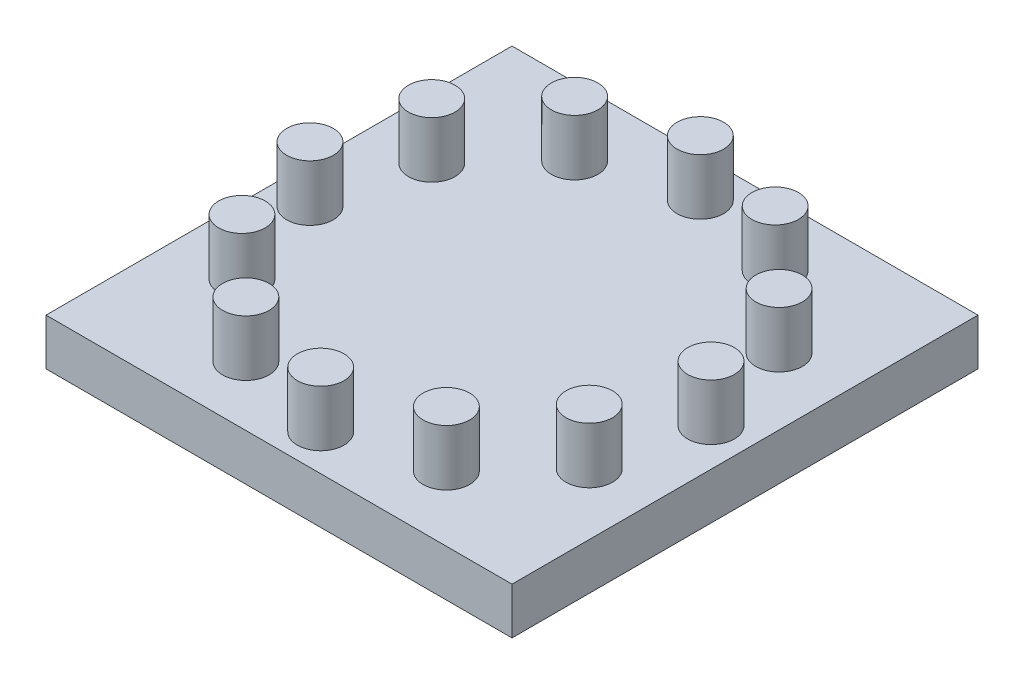
ISO-10303-21;
HEADER;
FILE_DESCRIPTION(('STEP AP214'),'2;1');
FILE_NAME('part.step','',(''),(''),'','','');
FILE_SCHEMA(('AUTOMOTIVE_DESIGN { 1 0 10303 214 1 1 1 1 }'));
ENDSEC;
DATA;
#1=APPLICATION_CONTEXT('core data for automotive mechanical design processes');
#2=APPLICATION_PROTOCOL_DEFINITION('international standard','automotive_design',2000,#1);
#3=PRODUCT_CONTEXT('',#1,'mechanical');
#4=PRODUCT('Part','Part','',(#3));
#5=PRODUCT_RELATED_PRODUCT_CATEGORY('part','',(#4));
#6=PRODUCT_DEFINITION_FORMATION('','',#4);
#7=PRODUCT_DEFINITION_CONTEXT('part definition',#1,'design');
#8=PRODUCT_DEFINITION('design','',#6,#7);
#9=PRODUCT_DEFINITION_SHAPE('','',#8);
#10=(LENGTH_UNIT() NAMED_UNIT(*) SI_UNIT(.MILLI.,.METRE.));
#11=(NAMED_UNIT(*) PLANE_ANGLE_UNIT() SI_UNIT($,.RADIAN.));
#12=(NAMED_UNIT(*) SI_UNIT($,.STERADIAN.) SOLID_ANGLE_UNIT());
#13=UNCERTAINTY_MEASURE_WITH_UNIT(LENGTH_MEASURE(1.E-05),#10,'distance_accuracy_value','');
#14=(GEOMETRIC_REPRESENTATION_CONTEXT(3) GLOBAL_UNCERTAINTY_ASSIGNED_CONTEXT((#13)) GLOBAL_UNIT_ASSIGNED_CONTEXT((#10,
#11,#12)) REPRESENTATION_CONTEXT('',''));
#15=CARTESIAN_POINT('',(0.,0.,0.));
#16=DIRECTION('',(0.,0.,1.));
#17=DIRECTION('',(1.,0.,0.));
#18=AXIS2_PLACEMENT_3D('',#15,#16,#17);
#19=CARTESIAN_POINT('',(50.,10.,-50.));
#20=DIRECTION('',(-1.,0.,0.));
#21=DIRECTION('',(0.,0.,1.));
#22=AXIS2_PLACEMENT_3D('',#19,#20,#21);
#23=PLANE('',#22);
#24=DIRECTION('',(0.,0.,-1.));
#25=VECTOR('',#24,1.);
#26=CARTESIAN_POINT('',(50.,0.,-50.));
#27=LINE('',#26,#25);
#28=CARTESIAN_POINT('',(50.,0.,50.));
#29=VERTEX_POINT('',#28);
#30=CARTESIAN_POINT('',(50.,0.,-50.));
#31=VERTEX_POINT('',#30);
#32=EDGE_CURVE('E102',#29,#31,#27,.T.);
#33=ORIENTED_EDGE('',*,*,#32,.T.);
#34=DIRECTION('',(0.,-1.,0.));
#35=VECTOR('',#34,1.);
#36=CARTESIAN_POINT('',(50.,10.,-50.));
#37=LINE('',#36,#35);
#38=CARTESIAN_POINT('',(50.,10.,-50.));
#39=VERTEX_POINT('',#38);
#40=EDGE_CURVE('E11',#39,#31,#37,.T.);
#41=ORIENTED_EDGE('',*,*,#40,.F.);
#42=DIRECTION('',(0.,0.,-1.));
#43=VECTOR('',#42,1.);
#44=CARTESIAN_POINT('',(50.,10.,-50.));
#45=LINE('',#44,#43);
#46=CARTESIAN_POINT('',(50.,10.,50.));
#47=VERTEX_POINT('',#46);
#48=EDGE_CURVE('E90',#47,#39,#45,.T.);
#49=ORIENTED_EDGE('',*,*,#48,.F.);
#50=DIRECTION('',(0.,-1.,0.));
#51=VECTOR('',#50,1.);
#52=CARTESIAN_POINT('',(50.,10.,50.));
#53=LINE('',#52,#51);
#54=EDGE_CURVE('E98',#47,#29,#53,.T.);
#55=ORIENTED_EDGE('',*,*,#54,.T.);
#56=EDGE_LOOP('',(#33,#41,#49,#55));
#57=FACE_BOUND('',#56,.T.);
#58=ADVANCED_FACE('F39',(#57),#23,.F.);
#59=CARTESIAN_POINT('',(-50.,10.,-50.));
#60=DIRECTION('',(0.,0.,1.));
#61=DIRECTION('',(1.,0.,0.));
#62=AXIS2_PLACEMENT_3D('',#59,#60,#61);
#63=PLANE('',#62);
#64=DIRECTION('',(-1.,0.,0.));
#65=VECTOR('',#64,1.);
#66=CARTESIAN_POINT('',(-50.,0.,-50.));
#67=LINE('',#66,#65);
#68=CARTESIAN_POINT('',(-50.,0.,-50.));
#69=VERTEX_POINT('',#68);
#70=EDGE_CURVE('E94',#31,#69,#67,.T.);
#71=ORIENTED_EDGE('',*,*,#70,.T.);
#72=DIRECTION('',(0.,-1.,0.));
#73=VECTOR('',#72,1.);
#74=CARTESIAN_POINT('',(-50.,10.,-50.));
#75=LINE('',#74,#73);
#76=CARTESIAN_POINT('',(-50.,10.,-50.));
#77=VERTEX_POINT('',#76);
#78=EDGE_CURVE('E47',#77,#69,#75,.T.);
#79=ORIENTED_EDGE('',*,*,#78,.F.);
#80=DIRECTION('',(-1.,0.,0.));
#81=VECTOR('',#80,1.);
#82=CARTESIAN_POINT('',(-50.,10.,-50.));
#83=LINE('',#82,#81);
#84=EDGE_CURVE('E85',#39,#77,#83,.T.);
#85=ORIENTED_EDGE('',*,*,#84,.F.);
#86=ORIENTED_EDGE('',*,*,#40,.T.);
#87=EDGE_LOOP('',(#71,#79,#85,#86));
#88=FACE_BOUND('',#87,.T.);
#89=ADVANCED_FACE('F93',(#88),#63,.F.);
#90=CARTESIAN_POINT('',(-50.,10.,-50.));
#91=DIRECTION('',(1.,0.,0.));
#92=DIRECTION('',(0.,0.,-1.));
#93=AXIS2_PLACEMENT_3D('',#90,#91,#92);
#94=PLANE('',#93);
#95=DIRECTION('',(0.,0.,1.));
#96=VECTOR('',#95,1.);
#97=CARTESIAN_POINT('',(-50.,0.,-50.));
#98=LINE('',#97,#96);
#99=CARTESIAN_POINT('',(-50.,0.,50.));
#100=VERTEX_POINT('',#99);
#101=EDGE_CURVE('E72',#69,#100,#98,.T.);
#102=ORIENTED_EDGE('',*,*,#101,.T.);
#103=DIRECTION('',(0.,-1.,0.));
#104=VECTOR('',#103,1.);
#105=CARTESIAN_POINT('',(-50.,10.,50.));
#106=LINE('',#105,#104);
#107=CARTESIAN_POINT('',(-50.,10.,50.));
#108=VERTEX_POINT('',#107);
#109=EDGE_CURVE('E95',#108,#100,#106,.T.);
#110=ORIENTED_EDGE('',*,*,#109,.F.);
#111=DIRECTION('',(0.,0.,1.));
#112=VECTOR('',#111,1.);
#113=CARTESIAN_POINT('',(-50.,10.,-50.));
#114=LINE('',#113,#112);
#115=EDGE_CURVE('E88',#77,#108,#114,.T.);
#116=ORIENTED_EDGE('',*,*,#115,.F.);
#117=ORIENTED_EDGE('',*,*,#78,.T.);
#118=EDGE_LOOP('',(#102,#110,#116,#117));
#119=FACE_BOUND('',#118,.T.);
#120=ADVANCED_FACE('F96',(#119),#94,.F.);
#121=CARTESIAN_POINT('',(-50.,10.,50.));
#122=DIRECTION('',(0.,0.,-1.));
#123=DIRECTION('',(-1.,0.,0.));
#124=AXIS2_PLACEMENT_3D('',#121,#122,#123);
#125=PLANE('',#124);
#126=DIRECTION('',(1.,0.,0.));
#127=VECTOR('',#126,1.);
#128=CARTESIAN_POINT('',(-50.,0.,50.));
#129=LINE('',#128,#127);
#130=EDGE_CURVE('E78',#100,#29,#129,.T.);
#131=ORIENTED_EDGE('',*,*,#130,.T.);
#132=ORIENTED_EDGE('',*,*,#54,.F.);
#133=DIRECTION('',(1.,0.,0.));
#134=VECTOR('',#133,1.);
#135=CARTESIAN_POINT('',(-50.,10.,50.));
#136=LINE('',#135,#134);
#137=EDGE_CURVE('E55',#108,#47,#136,.T.);
#138=ORIENTED_EDGE('',*,*,#137,.F.);
#139=ORIENTED_EDGE('',*,*,#109,.T.);
#140=EDGE_LOOP('',(#131,#132,#138,#139));
#141=FACE_BOUND('',#140,.T.);
#142=ADVANCED_FACE('F110',(#141),#125,.F.);
#143=CARTESIAN_POINT('',(0.,10.,0.));
#144=DIRECTION('',(0.,1.,0.));
#145=DIRECTION('',(0.,0.,1.));
#146=AXIS2_PLACEMENT_3D('',#143,#144,#145);
#147=PLANE('',#146);
#148=CARTESIAN_POINT('',(19.9548322317061,10.,-36.5170698753172));
#149=DIRECTION('',(0.,1.,0.));
#150=DIRECTION('',(-0.499999999999989,0.,0.866025403784445));
#151=AXIS2_PLACEMENT_3D('',#148,#149,#150);
#152=CIRCLE('',#151,5.);
#153=CARTESIAN_POINT('',(17.4548322317061,10.,-32.186942856395));
#154=VERTEX_POINT('',#153);
#155=EDGE_CURVE('E182',#154,#154,#152,.T.);
#156=ORIENTED_EDGE('',*,*,#155,.F.);
#157=EDGE_LOOP('',(#156));
#158=FACE_BOUND('',#157,.T.);
#159=CARTESIAN_POINT('',(35.7056081919247,10.,-21.607737705962));
#160=DIRECTION('',(0.,1.,0.));
#161=DIRECTION('',(-0.866025403784433,0.,0.50000000000001));
#162=AXIS2_PLACEMENT_3D('',#159,#160,#161);
#163=CIRCLE('',#162,5.);
#164=CARTESIAN_POINT('',(31.3754811730026,10.,-19.1077377059619));
#165=VERTEX_POINT('',#164);
#166=EDGE_CURVE('E176',#165,#165,#163,.T.);
#167=ORIENTED_EDGE('',*,*,#166,.F.);
#168=EDGE_LOOP('',(#167));
#169=FACE_BOUND('',#168,.T.);
#170=CARTESIAN_POINT('',(41.8915142181137,10.,-0.820489313730515));
#171=DIRECTION('',(0.,1.,0.));
#172=DIRECTION('',(-1.,0.,0.));
#173=AXIS2_PLACEMENT_3D('',#170,#171,#172);
#174=CIRCLE('',#173,5.);
#175=CARTESIAN_POINT('',(36.8915142181137,10.,-0.820489313730463));
#176=VERTEX_POINT('',#175);
#177=EDGE_CURVE('E170',#176,#176,#174,.T.);
#178=ORIENTED_EDGE('',*,*,#177,.F.);
#179=EDGE_LOOP('',(#178));
#180=FACE_BOUND('',#179,.T.);
#181=CARTESIAN_POINT('',(36.8550417861008,10.,20.2747488818137));
#182=DIRECTION('',(0.,1.,0.));
#183=DIRECTION('',(-0.866025403784443,0.,-0.499999999999992));
#184=AXIS2_PLACEMENT_3D('',#181,#182,#183);
#185=CIRCLE('',#184,5.);
#186=CARTESIAN_POINT('',(32.5249147671786,10.,17.7747488818137));
#187=VERTEX_POINT('',#186);
#188=EDGE_CURVE('E164',#187,#187,#185,.T.);
#189=ORIENTED_EDGE('',*,*,#188,.F.);
#190=EDGE_LOOP('',(#189));
#191=FACE_BOUND('',#190,.T.);
#192=CARTESIAN_POINT('',(21.9457096167456,10.,36.0255248420322));
#193=DIRECTION('',(0.,1.,0.));
#194=DIRECTION('',(-0.500000000000007,0.,-0.866025403784435));
#195=AXIS2_PLACEMENT_3D('',#192,#193,#194);
#196=CIRCLE('',#195,5.);
#197=CARTESIAN_POINT('',(19.4457096167455,10.,31.6953978231101));
#198=VERTEX_POINT('',#197);
#199=EDGE_CURVE('E158',#198,#198,#196,.T.);
#200=ORIENTED_EDGE('',*,*,#199,.F.);
#201=EDGE_LOOP('',(#200));
#202=FACE_BOUND('',#201,.T.);
#203=CARTESIAN_POINT('',(1.15846122451378,10.,42.2114308682211));
#204=DIRECTION('',(0.,1.,0.));
#205=DIRECTION('',(0.,0.,-1.));
#206=AXIS2_PLACEMENT_3D('',#203,#204,#205);
#207=CIRCLE('',#206,5.);
#208=CARTESIAN_POINT('',(1.15846122451378,10.,37.2114308682211));
#209=VERTEX_POINT('',#208);
#210=EDGE_CURVE('E152',#209,#209,#207,.T.);
#211=ORIENTED_EDGE('',*,*,#210,.F.);
#212=EDGE_LOOP('',(#211));
#213=FACE_BOUND('',#212,.T.);
#214=CARTESIAN_POINT('',(-19.9367769710301,10.,37.1749584362082));
#215=DIRECTION('',(0.,1.,0.));
#216=DIRECTION('',(0.499999999999995,0.,-0.866025403784442));
#217=AXIS2_PLACEMENT_3D('',#214,#215,#216);
#218=CIRCLE('',#217,5.);
#219=CARTESIAN_POINT('',(-17.4367769710301,10.,32.844831417286));
#220=VERTEX_POINT('',#219);
#221=EDGE_CURVE('E146',#220,#220,#218,.T.);
#222=ORIENTED_EDGE('',*,*,#221,.F.);
#223=EDGE_LOOP('',(#222));
#224=FACE_BOUND('',#223,.T.);
#225=CARTESIAN_POINT('',(-35.6875529312486,10.,22.2656262668529));
#226=DIRECTION('',(0.,1.,0.));
#227=DIRECTION('',(0.866025403784436,0.,-0.500000000000004));
#228=AXIS2_PLACEMENT_3D('',#225,#226,#227);
#229=CIRCLE('',#228,5.);
#230=CARTESIAN_POINT('',(-31.3574259123264,10.,19.7656262668529));
#231=VERTEX_POINT('',#230);
#232=EDGE_CURVE('E140',#231,#231,#229,.T.);
#233=ORIENTED_EDGE('',*,*,#232,.F.);
#234=EDGE_LOOP('',(#233));
#235=FACE_BOUND('',#234,.T.);
#236=CARTESIAN_POINT('',(-41.8734589574374,10.,1.47837787462137));
#237=DIRECTION('',(0.,1.,0.));
#238=DIRECTION('',(1.,0.,0.));
#239=AXIS2_PLACEMENT_3D('',#236,#237,#238);
#240=CIRCLE('',#239,5.);
#241=CARTESIAN_POINT('',(-36.8734589574374,10.,1.47837787462135));
#242=VERTEX_POINT('',#241);
#243=EDGE_CURVE('E134',#242,#242,#240,.T.);
#244=ORIENTED_EDGE('',*,*,#243,.F.);
#245=EDGE_LOOP('',(#244));
#246=FACE_BOUND('',#245,.T.);
#247=CARTESIAN_POINT('',(-36.8369865254244,10.,-19.6168603209228));
#248=DIRECTION('',(0.,1.,0.));
#249=DIRECTION('',(0.86602540378444,0.,0.499999999999998));
#250=AXIS2_PLACEMENT_3D('',#247,#248,#249);
#251=CIRCLE('',#250,5.);
#252=CARTESIAN_POINT('',(-32.5068595065022,10.,-17.1168603209228));
#253=VERTEX_POINT('',#252);
#254=EDGE_CURVE('E128',#253,#253,#251,.T.);
#255=ORIENTED_EDGE('',*,*,#254,.F.);
#256=EDGE_LOOP('',(#255));
#257=FACE_BOUND('',#256,.T.);
#258=CARTESIAN_POINT('',(-21.9276543560691,10.,-35.3676362811413));
#259=DIRECTION('',(0.,1.,0.));
#260=DIRECTION('',(0.500000000000001,0.,0.866025403784438));
#261=AXIS2_PLACEMENT_3D('',#258,#259,#260);
#262=CIRCLE('',#261,5.);
#263=CARTESIAN_POINT('',(-19.4276543560691,10.,-31.0375092622191));
#264=VERTEX_POINT('',#263);
#265=EDGE_CURVE('E122',#264,#264,#262,.T.);
#266=ORIENTED_EDGE('',*,*,#265,.F.);
#267=EDGE_LOOP('',(#266));
#268=FACE_BOUND('',#267,.T.);
#269=CARTESIAN_POINT('',(-1.14040596383752,10.,-41.55354230733));
#270=DIRECTION('',(0.,1.,0.));
#271=DIRECTION('',(0.,0.,1.));
#272=AXIS2_PLACEMENT_3D('',#269,#270,#271);
#273=CIRCLE('',#272,5.);
#274=CARTESIAN_POINT('',(-1.14040596383752,10.,-36.55354230733));
#275=VERTEX_POINT('',#274);
#276=EDGE_CURVE('E116',#275,#275,#273,.T.);
#277=ORIENTED_EDGE('',*,*,#276,.F.);
#278=EDGE_LOOP('',(#277));
#279=FACE_BOUND('',#278,.T.);
#280=ORIENTED_EDGE('',*,*,#48,.T.);
#281=ORIENTED_EDGE('',*,*,#84,.T.);
#282=ORIENTED_EDGE('',*,*,#115,.T.);
#283=ORIENTED_EDGE('',*,*,#137,.T.);
#284=EDGE_LOOP('',(#280,#281,#282,#283));
#285=FACE_BOUND('',#284,.T.);
#286=ADVANCED_FACE('F86',(#158,#169,#180,#191,#202,#213,#224,#235,#246,#257,#268,#279,#285),
#147,.T.);
#287=CARTESIAN_POINT('',(0.,0.,0.));
#288=DIRECTION('',(0.,1.,0.));
#289=DIRECTION('',(0.,0.,1.));
#290=AXIS2_PLACEMENT_3D('',#287,#288,#289);
#291=PLANE('',#290);
#292=ORIENTED_EDGE('',*,*,#32,.F.);
#293=ORIENTED_EDGE('',*,*,#130,.F.);
#294=ORIENTED_EDGE('',*,*,#101,.F.);
#295=ORIENTED_EDGE('',*,*,#70,.F.);
#296=EDGE_LOOP('',(#292,#293,#294,#295));
#297=FACE_BOUND('',#296,.T.);
#298=ADVANCED_FACE('F113',(#297),#291,.F.);
#299=CARTESIAN_POINT('',(-1.14040596383752,22.,-41.55354230733));
#300=DIRECTION('',(0.,-1.,0.));
#301=DIRECTION('',(0.,0.,-1.));
#302=AXIS2_PLACEMENT_3D('',#299,#300,#301);
#303=CYLINDRICAL_SURFACE('',#302,5.);
#304=CARTESIAN_POINT('',(-1.14040596383752,22.,-41.55354230733));
#305=DIRECTION('',(0.,1.,0.));
#306=DIRECTION('',(0.,0.,1.));
#307=AXIS2_PLACEMENT_3D('',#304,#305,#306);
#308=CIRCLE('',#307,5.);
#309=CARTESIAN_POINT('',(-1.14040596383752,22.,-36.55354230733));
#310=VERTEX_POINT('',#309);
#311=EDGE_CURVE('E105',#310,#310,#308,.T.);
#312=ORIENTED_EDGE('',*,*,#311,.F.);
#313=EDGE_LOOP('',(#312));
#314=FACE_BOUND('',#313,.T.);
#315=ORIENTED_EDGE('',*,*,#276,.T.);
#316=EDGE_LOOP('',(#315));
#317=FACE_BOUND('',#316,.T.);
#318=ADVANCED_FACE('F222',(#314,#317),#303,.T.);
#319=CARTESIAN_POINT('',(-1.14040596383752,22.,-41.55354230733));
#320=DIRECTION('',(0.,1.,0.));
#321=DIRECTION('',(0.,0.,1.));
#322=AXIS2_PLACEMENT_3D('',#319,#320,#321);
#323=PLANE('',#322);
#324=ORIENTED_EDGE('',*,*,#311,.T.);
#325=EDGE_LOOP('',(#324));
#326=FACE_BOUND('',#325,.T.);
#327=ADVANCED_FACE('F224',(#326),#323,.T.);
#328=CARTESIAN_POINT('',(-21.9276543560691,22.,-35.3676362811413));
#329=DIRECTION('',(0.,-1.,0.));
#330=DIRECTION('',(0.,0.,-1.));
#331=AXIS2_PLACEMENT_3D('',#328,#329,#330);
#332=CYLINDRICAL_SURFACE('',#331,5.);
#333=CARTESIAN_POINT('',(-21.9276543560691,22.,-35.3676362811413));
#334=DIRECTION('',(0.,1.,0.));
#335=DIRECTION('',(0.500000000000001,0.,0.866025403784438));
#336=AXIS2_PLACEMENT_3D('',#333,#334,#335);
#337=CIRCLE('',#336,5.);
#338=CARTESIAN_POINT('',(-19.4276543560691,22.,-31.0375092622191));
#339=VERTEX_POINT('',#338);
#340=EDGE_CURVE('E119',#339,#339,#337,.T.);
#341=ORIENTED_EDGE('',*,*,#340,.F.);
#342=EDGE_LOOP('',(#341));
#343=FACE_BOUND('',#342,.T.);
#344=ORIENTED_EDGE('',*,*,#265,.T.);
#345=EDGE_LOOP('',(#344));
#346=FACE_BOUND('',#345,.T.);
#347=ADVANCED_FACE('F231',(#343,#346),#332,.T.);
#348=CARTESIAN_POINT('',(-21.9276543560691,22.,-35.3676362811413));
#349=DIRECTION('',(0.,1.,0.));
#350=DIRECTION('',(0.500000000000001,0.,0.866025403784438));
#351=AXIS2_PLACEMENT_3D('',#348,#349,#350);
#352=PLANE('',#351);
#353=ORIENTED_EDGE('',*,*,#340,.T.);
#354=EDGE_LOOP('',(#353));
#355=FACE_BOUND('',#354,.T.);
#356=ADVANCED_FACE('F279',(#355),#352,.T.);
#357=CARTESIAN_POINT('',(-36.8369865254244,22.,-19.6168603209228));
#358=DIRECTION('',(0.,-1.,0.));
#359=DIRECTION('',(0.,0.,-1.));
#360=AXIS2_PLACEMENT_3D('',#357,#358,#359);
#361=CYLINDRICAL_SURFACE('',#360,5.);
#362=CARTESIAN_POINT('',(-36.8369865254244,22.,-19.6168603209228));
#363=DIRECTION('',(0.,1.,0.));
#364=DIRECTION('',(0.86602540378444,0.,0.499999999999998));
#365=AXIS2_PLACEMENT_3D('',#362,#363,#364);
#366=CIRCLE('',#365,5.);
#367=CARTESIAN_POINT('',(-32.5068595065022,22.,-17.1168603209228));
#368=VERTEX_POINT('',#367);
#369=EDGE_CURVE('E125',#368,#368,#366,.T.);
#370=ORIENTED_EDGE('',*,*,#369,.F.);
#371=EDGE_LOOP('',(#370));
#372=FACE_BOUND('',#371,.T.);
#373=ORIENTED_EDGE('',*,*,#254,.T.);
#374=EDGE_LOOP('',(#373));
#375=FACE_BOUND('',#374,.T.);
#376=ADVANCED_FACE('F289',(#372,#375),#361,.T.);
#377=CARTESIAN_POINT('',(-36.8369865254244,22.,-19.6168603209228));
#378=DIRECTION('',(0.,1.,0.));
#379=DIRECTION('',(0.86602540378444,0.,0.499999999999998));
#380=AXIS2_PLACEMENT_3D('',#377,#378,#379);
#381=PLANE('',#380);
#382=ORIENTED_EDGE('',*,*,#369,.T.);
#383=EDGE_LOOP('',(#382));
#384=FACE_BOUND('',#383,.T.);
#385=ADVANCED_FACE('F299',(#384),#381,.T.);
#386=CARTESIAN_POINT('',(-41.8734589574374,22.,1.47837787462137));
#387=DIRECTION('',(0.,-1.,0.));
#388=DIRECTION('',(0.,0.,-1.));
#389=AXIS2_PLACEMENT_3D('',#386,#387,#388);
#390=CYLINDRICAL_SURFACE('',#389,5.);
#391=CARTESIAN_POINT('',(-41.8734589574374,22.,1.47837787462137));
#392=DIRECTION('',(0.,1.,0.));
#393=DIRECTION('',(1.,0.,0.));
#394=AXIS2_PLACEMENT_3D('',#391,#392,#393);
#395=CIRCLE('',#394,5.);
#396=CARTESIAN_POINT('',(-36.8734589574374,22.,1.47837787462135));
#397=VERTEX_POINT('',#396);
#398=EDGE_CURVE('E131',#397,#397,#395,.T.);
#399=ORIENTED_EDGE('',*,*,#398,.F.);
#400=EDGE_LOOP('',(#399));
#401=FACE_BOUND('',#400,.T.);
#402=ORIENTED_EDGE('',*,*,#243,.T.);
#403=EDGE_LOOP('',(#402));
#404=FACE_BOUND('',#403,.T.);
#405=ADVANCED_FACE('F309',(#401,#404),#390,.T.);
#406=CARTESIAN_POINT('',(-41.8734589574374,22.,1.47837787462137));
#407=DIRECTION('',(0.,1.,0.));
#408=DIRECTION('',(1.,0.,0.));
#409=AXIS2_PLACEMENT_3D('',#406,#407,#408);
#410=PLANE('',#409);
#411=ORIENTED_EDGE('',*,*,#398,.T.);
#412=EDGE_LOOP('',(#411));
#413=FACE_BOUND('',#412,.T.);
#414=ADVANCED_FACE('F319',(#413),#410,.T.);
#415=CARTESIAN_POINT('',(-35.6875529312486,22.,22.2656262668529));
#416=DIRECTION('',(0.,-1.,0.));
#417=DIRECTION('',(0.,0.,-1.));
#418=AXIS2_PLACEMENT_3D('',#415,#416,#417);
#419=CYLINDRICAL_SURFACE('',#418,5.);
#420=CARTESIAN_POINT('',(-35.6875529312486,22.,22.2656262668529));
#421=DIRECTION('',(0.,1.,0.));
#422=DIRECTION('',(0.866025403784436,0.,-0.500000000000004));
#423=AXIS2_PLACEMENT_3D('',#420,#421,#422);
#424=CIRCLE('',#423,5.);
#425=CARTESIAN_POINT('',(-31.3574259123264,22.,19.7656262668529));
#426=VERTEX_POINT('',#425);
#427=EDGE_CURVE('E137',#426,#426,#424,.T.);
#428=ORIENTED_EDGE('',*,*,#427,.F.);
#429=EDGE_LOOP('',(#428));
#430=FACE_BOUND('',#429,.T.);
#431=ORIENTED_EDGE('',*,*,#232,.T.);
#432=EDGE_LOOP('',(#431));
#433=FACE_BOUND('',#432,.T.);
#434=ADVANCED_FACE('F329',(#430,#433),#419,.T.);
#435=CARTESIAN_POINT('',(-35.6875529312486,22.,22.2656262668529));
#436=DIRECTION('',(0.,1.,0.));
#437=DIRECTION('',(0.866025403784436,0.,-0.500000000000004));
#438=AXIS2_PLACEMENT_3D('',#435,#436,#437);
#439=PLANE('',#438);
#440=ORIENTED_EDGE('',*,*,#427,.T.);
#441=EDGE_LOOP('',(#440));
#442=FACE_BOUND('',#441,.T.);
#443=ADVANCED_FACE('F339',(#442),#439,.T.);
#444=CARTESIAN_POINT('',(-19.9367769710301,22.,37.1749584362082));
#445=DIRECTION('',(0.,-1.,0.));
#446=DIRECTION('',(0.,0.,-1.));
#447=AXIS2_PLACEMENT_3D('',#444,#445,#446);
#448=CYLINDRICAL_SURFACE('',#447,5.);
#449=CARTESIAN_POINT('',(-19.9367769710301,22.,37.1749584362082));
#450=DIRECTION('',(0.,1.,0.));
#451=DIRECTION('',(0.499999999999995,0.,-0.866025403784442));
#452=AXIS2_PLACEMENT_3D('',#449,#450,#451);
#453=CIRCLE('',#452,5.);
#454=CARTESIAN_POINT('',(-17.4367769710301,22.,32.844831417286));
#455=VERTEX_POINT('',#454);
#456=EDGE_CURVE('E143',#455,#455,#453,.T.);
#457=ORIENTED_EDGE('',*,*,#456,.F.);
#458=EDGE_LOOP('',(#457));
#459=FACE_BOUND('',#458,.T.);
#460=ORIENTED_EDGE('',*,*,#221,.T.);
#461=EDGE_LOOP('',(#460));
#462=FACE_BOUND('',#461,.T.);
#463=ADVANCED_FACE('F349',(#459,#462),#448,.T.);
#464=CARTESIAN_POINT('',(-19.9367769710301,22.,37.1749584362082));
#465=DIRECTION('',(0.,1.,0.));
#466=DIRECTION('',(0.499999999999995,0.,-0.866025403784442));
#467=AXIS2_PLACEMENT_3D('',#464,#465,#466);
#468=PLANE('',#467);
#469=ORIENTED_EDGE('',*,*,#456,.T.);
#470=EDGE_LOOP('',(#469));
#471=FACE_BOUND('',#470,.T.);
#472=ADVANCED_FACE('F359',(#471),#468,.T.);
#473=CARTESIAN_POINT('',(1.15846122451378,22.,42.2114308682211));
#474=DIRECTION('',(0.,-1.,0.));
#475=DIRECTION('',(0.,0.,-1.));
#476=AXIS2_PLACEMENT_3D('',#473,#474,#475);
#477=CYLINDRICAL_SURFACE('',#476,5.);
#478=CARTESIAN_POINT('',(1.15846122451378,22.,42.2114308682211));
#479=DIRECTION('',(0.,1.,0.));
#480=DIRECTION('',(0.,0.,-1.));
#481=AXIS2_PLACEMENT_3D('',#478,#479,#480);
#482=CIRCLE('',#481,5.);
#483=CARTESIAN_POINT('',(1.15846122451378,22.,37.2114308682211));
#484=VERTEX_POINT('',#483);
#485=EDGE_CURVE('E149',#484,#484,#482,.T.);
#486=ORIENTED_EDGE('',*,*,#485,.F.);
#487=EDGE_LOOP('',(#486));
#488=FACE_BOUND('',#487,.T.);
#489=ORIENTED_EDGE('',*,*,#210,.T.);
#490=EDGE_LOOP('',(#489));
#491=FACE_BOUND('',#490,.T.);
#492=ADVANCED_FACE('F369',(#488,#491),#477,.T.);
#493=CARTESIAN_POINT('',(1.15846122451378,22.,42.2114308682211));
#494=DIRECTION('',(0.,1.,0.));
#495=DIRECTION('',(0.,0.,-1.));
#496=AXIS2_PLACEMENT_3D('',#493,#494,#495);
#497=PLANE('',#496);
#498=ORIENTED_EDGE('',*,*,#485,.T.);
#499=EDGE_LOOP('',(#498));
#500=FACE_BOUND('',#499,.T.);
#501=ADVANCED_FACE('F379',(#500),#497,.T.);
#502=CARTESIAN_POINT('',(21.9457096167456,22.,36.0255248420322));
#503=DIRECTION('',(0.,-1.,0.));
#504=DIRECTION('',(0.,0.,-1.));
#505=AXIS2_PLACEMENT_3D('',#502,#503,#504);
#506=CYLINDRICAL_SURFACE('',#505,5.);
#507=CARTESIAN_POINT('',(21.9457096167456,22.,36.0255248420322));
#508=DIRECTION('',(0.,1.,0.));
#509=DIRECTION('',(-0.500000000000007,0.,-0.866025403784435));
#510=AXIS2_PLACEMENT_3D('',#507,#508,#509);
#511=CIRCLE('',#510,5.);
#512=CARTESIAN_POINT('',(19.4457096167455,22.,31.6953978231101));
#513=VERTEX_POINT('',#512);
#514=EDGE_CURVE('E155',#513,#513,#511,.T.);
#515=ORIENTED_EDGE('',*,*,#514,.F.);
#516=EDGE_LOOP('',(#515));
#517=FACE_BOUND('',#516,.T.);
#518=ORIENTED_EDGE('',*,*,#199,.T.);
#519=EDGE_LOOP('',(#518));
#520=FACE_BOUND('',#519,.T.);
#521=ADVANCED_FACE('F389',(#517,#520),#506,.T.);
#522=CARTESIAN_POINT('',(21.9457096167456,22.,36.0255248420322));
#523=DIRECTION('',(0.,1.,0.));
#524=DIRECTION('',(-0.500000000000007,0.,-0.866025403784435));
#525=AXIS2_PLACEMENT_3D('',#522,#523,#524);
#526=PLANE('',#525);
#527=ORIENTED_EDGE('',*,*,#514,.T.);
#528=EDGE_LOOP('',(#527));
#529=FACE_BOUND('',#528,.T.);
#530=ADVANCED_FACE('F399',(#529),#526,.T.);
#531=CARTESIAN_POINT('',(36.8550417861008,22.,20.2747488818137));
#532=DIRECTION('',(0.,-1.,0.));
#533=DIRECTION('',(0.,0.,-1.));
#534=AXIS2_PLACEMENT_3D('',#531,#532,#533);
#535=CYLINDRICAL_SURFACE('',#534,5.);
#536=CARTESIAN_POINT('',(36.8550417861008,22.,20.2747488818137));
#537=DIRECTION('',(0.,1.,0.));
#538=DIRECTION('',(-0.866025403784443,0.,-0.499999999999992));
#539=AXIS2_PLACEMENT_3D('',#536,#537,#538);
#540=CIRCLE('',#539,5.);
#541=CARTESIAN_POINT('',(32.5249147671786,22.,17.7747488818137));
#542=VERTEX_POINT('',#541);
#543=EDGE_CURVE('E161',#542,#542,#540,.T.);
#544=ORIENTED_EDGE('',*,*,#543,.F.);
#545=EDGE_LOOP('',(#544));
#546=FACE_BOUND('',#545,.T.);
#547=ORIENTED_EDGE('',*,*,#188,.T.);
#548=EDGE_LOOP('',(#547));
#549=FACE_BOUND('',#548,.T.);
#550=ADVANCED_FACE('F409',(#546,#549),#535,.T.);
#551=CARTESIAN_POINT('',(36.8550417861008,22.,20.2747488818137));
#552=DIRECTION('',(0.,1.,0.));
#553=DIRECTION('',(-0.866025403784443,0.,-0.499999999999992));
#554=AXIS2_PLACEMENT_3D('',#551,#552,#553);
#555=PLANE('',#554);
#556=ORIENTED_EDGE('',*,*,#543,.T.);
#557=EDGE_LOOP('',(#556));
#558=FACE_BOUND('',#557,.T.);
#559=ADVANCED_FACE('F419',(#558),#555,.T.);
#560=CARTESIAN_POINT('',(41.8915142181137,22.,-0.820489313730515));
#561=DIRECTION('',(0.,-1.,0.));
#562=DIRECTION('',(0.,0.,-1.));
#563=AXIS2_PLACEMENT_3D('',#560,#561,#562);
#564=CYLINDRICAL_SURFACE('',#563,5.);
#565=CARTESIAN_POINT('',(41.8915142181137,22.,-0.820489313730515));
#566=DIRECTION('',(0.,1.,0.));
#567=DIRECTION('',(-1.,0.,0.));
#568=AXIS2_PLACEMENT_3D('',#565,#566,#567);
#569=CIRCLE('',#568,5.);
#570=CARTESIAN_POINT('',(36.8915142181137,22.,-0.820489313730463));
#571=VERTEX_POINT('',#570);
#572=EDGE_CURVE('E167',#571,#571,#569,.T.);
#573=ORIENTED_EDGE('',*,*,#572,.F.);
#574=EDGE_LOOP('',(#573));
#575=FACE_BOUND('',#574,.T.);
#576=ORIENTED_EDGE('',*,*,#177,.T.);
#577=EDGE_LOOP('',(#576));
#578=FACE_BOUND('',#577,.T.);
#579=ADVANCED_FACE('F429',(#575,#578),#564,.T.);
#580=CARTESIAN_POINT('',(41.8915142181137,22.,-0.820489313730515));
#581=DIRECTION('',(0.,1.,0.));
#582=DIRECTION('',(-1.,0.,0.));
#583=AXIS2_PLACEMENT_3D('',#580,#581,#582);
#584=PLANE('',#583);
#585=ORIENTED_EDGE('',*,*,#572,.T.);
#586=EDGE_LOOP('',(#585));
#587=FACE_BOUND('',#586,.T.);
#588=ADVANCED_FACE('F439',(#587),#584,.T.);
#589=CARTESIAN_POINT('',(35.7056081919247,22.,-21.607737705962));
#590=DIRECTION('',(0.,-1.,0.));
#591=DIRECTION('',(0.,0.,-1.));
#592=AXIS2_PLACEMENT_3D('',#589,#590,#591);
#593=CYLINDRICAL_SURFACE('',#592,5.);
#594=CARTESIAN_POINT('',(35.7056081919247,22.,-21.607737705962));
#595=DIRECTION('',(0.,1.,0.));
#596=DIRECTION('',(-0.866025403784433,0.,0.50000000000001));
#597=AXIS2_PLACEMENT_3D('',#594,#595,#596);
#598=CIRCLE('',#597,5.);
#599=CARTESIAN_POINT('',(31.3754811730026,22.,-19.1077377059619));
#600=VERTEX_POINT('',#599);
#601=EDGE_CURVE('E173',#600,#600,#598,.T.);
#602=ORIENTED_EDGE('',*,*,#601,.F.);
#603=EDGE_LOOP('',(#602));
#604=FACE_BOUND('',#603,.T.);
#605=ORIENTED_EDGE('',*,*,#166,.T.);
#606=EDGE_LOOP('',(#605));
#607=FACE_BOUND('',#606,.T.);
#608=ADVANCED_FACE('F449',(#604,#607),#593,.T.);
#609=CARTESIAN_POINT('',(35.7056081919247,22.,-21.607737705962));
#610=DIRECTION('',(0.,1.,0.));
#611=DIRECTION('',(-0.866025403784433,0.,0.50000000000001));
#612=AXIS2_PLACEMENT_3D('',#609,#610,#611);
#613=PLANE('',#612);
#614=ORIENTED_EDGE('',*,*,#601,.T.);
#615=EDGE_LOOP('',(#614));
#616=FACE_BOUND('',#615,.T.);
#617=ADVANCED_FACE('F193',(#616),#613,.T.);
#618=CARTESIAN_POINT('',(19.9548322317061,22.,-36.5170698753172));
#619=DIRECTION('',(0.,-1.,0.));
#620=DIRECTION('',(0.,0.,-1.));
#621=AXIS2_PLACEMENT_3D('',#618,#619,#620);
#622=CYLINDRICAL_SURFACE('',#621,5.);
#623=CARTESIAN_POINT('',(19.9548322317061,22.,-36.5170698753172));
#624=DIRECTION('',(0.,1.,0.));
#625=DIRECTION('',(-0.499999999999989,0.,0.866025403784445));
#626=AXIS2_PLACEMENT_3D('',#623,#624,#625);
#627=CIRCLE('',#626,5.);
#628=CARTESIAN_POINT('',(17.4548322317061,22.,-32.186942856395));
#629=VERTEX_POINT('',#628);
#630=EDGE_CURVE('E179',#629,#629,#627,.T.);
#631=ORIENTED_EDGE('',*,*,#630,.F.);
#632=EDGE_LOOP('',(#631));
#633=FACE_BOUND('',#632,.T.);
#634=ORIENTED_EDGE('',*,*,#155,.T.);
#635=EDGE_LOOP('',(#634));
#636=FACE_BOUND('',#635,.T.);
#637=ADVANCED_FACE('F190',(#633,#636),#622,.T.);
#638=CARTESIAN_POINT('',(19.9548322317061,22.,-36.5170698753172));
#639=DIRECTION('',(0.,1.,0.));
#640=DIRECTION('',(-0.499999999999989,0.,0.866025403784445));
#641=AXIS2_PLACEMENT_3D('',#638,#639,#640);
#642=PLANE('',#641);
#643=ORIENTED_EDGE('',*,*,#630,.T.);
#644=EDGE_LOOP('',(#643));
#645=FACE_BOUND('',#644,.T.);
#646=ADVANCED_FACE('F188',(#645),#642,.T.);
#647=CLOSED_SHELL('',(#58,#89,#120,#142,#286,#298,#318,#327,#347,#356,#376,#385,#405,#414,#434,
#443,#463,#472,#492,#501,#521,#530,#550,#559,#579,#588,#608,#617,#637,#646));
#648=MANIFOLD_SOLID_BREP('B2',#647);
#649=ADVANCED_BREP_SHAPE_REPRESENTATION('',(#18,#648),#14);
#650=SHAPE_DEFINITION_REPRESENTATION(#9,#649);
ENDSEC;
END-ISO-10303-21;
